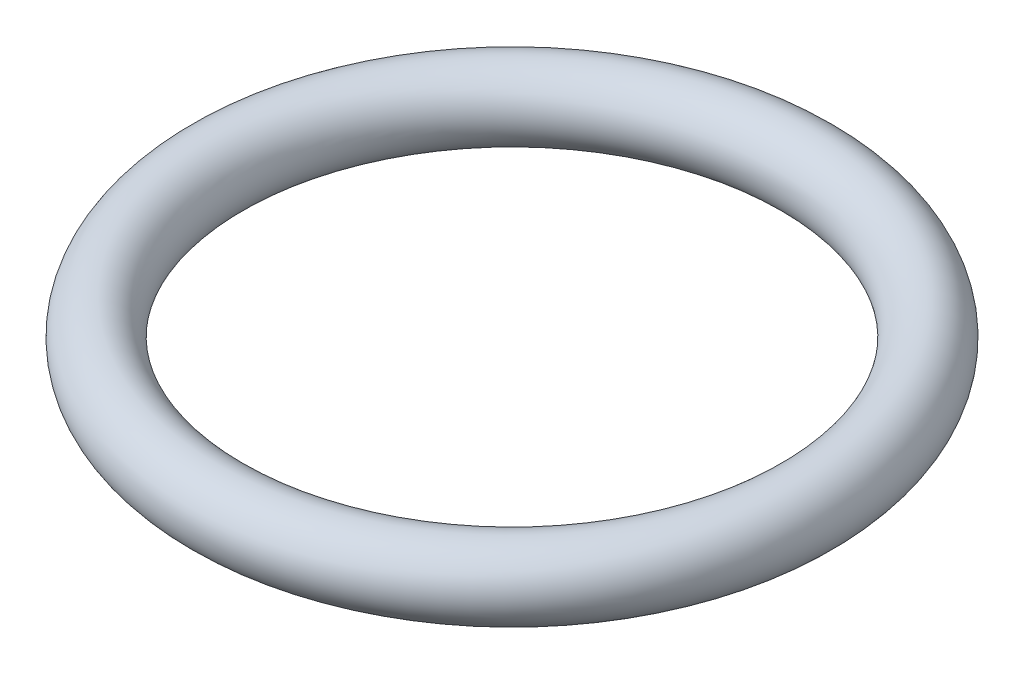
ISO-10303-21;
HEADER;
FILE_DESCRIPTION(('STEP AP214'),'2;1');
FILE_NAME('part.step','',(''),(''),'','','');
FILE_SCHEMA(('AUTOMOTIVE_DESIGN { 1 0 10303 214 1 1 1 1 }'));
ENDSEC;
DATA;
#1=APPLICATION_CONTEXT('core data for automotive mechanical design processes');
#2=APPLICATION_PROTOCOL_DEFINITION('international standard','automotive_design',2000,#1);
#3=PRODUCT_CONTEXT('',#1,'mechanical');
#4=PRODUCT('Part','Part','',(#3));
#5=PRODUCT_RELATED_PRODUCT_CATEGORY('part','',(#4));
#6=PRODUCT_DEFINITION_FORMATION('','',#4);
#7=PRODUCT_DEFINITION_CONTEXT('part definition',#1,'design');
#8=PRODUCT_DEFINITION('design','',#6,#7);
#9=PRODUCT_DEFINITION_SHAPE('','',#8);
#10=(LENGTH_UNIT() NAMED_UNIT(*) SI_UNIT(.MILLI.,.METRE.));
#11=(NAMED_UNIT(*) PLANE_ANGLE_UNIT() SI_UNIT($,.RADIAN.));
#12=(NAMED_UNIT(*) SI_UNIT($,.STERADIAN.) SOLID_ANGLE_UNIT());
#13=UNCERTAINTY_MEASURE_WITH_UNIT(LENGTH_MEASURE(1.E-05),#10,'distance_accuracy_value','');
#14=(GEOMETRIC_REPRESENTATION_CONTEXT(3) GLOBAL_UNCERTAINTY_ASSIGNED_CONTEXT((#13)) GLOBAL_UNIT_ASSIGNED_CONTEXT((#10,
#11,#12)) REPRESENTATION_CONTEXT('',''));
#15=CARTESIAN_POINT('',(0.,0.,0.));
#16=DIRECTION('',(0.,0.,1.));
#17=DIRECTION('',(1.,0.,0.));
#18=AXIS2_PLACEMENT_3D('',#15,#16,#17);
#19=CARTESIAN_POINT('',(0.,0.,0.));
#20=DIRECTION('',(0.,1.,0.));
#21=DIRECTION('',(0.,0.,1.));
#22=AXIS2_PLACEMENT_3D('',#19,#20,#21);
#23=TOROIDAL_SURFACE('',#22,11.,1.325);
#24=CARTESIAN_POINT('',(0.,0.,11.));
#25=DIRECTION('',(1.,0.,0.));
#26=DIRECTION('',(0.,0.,-1.));
#27=AXIS2_PLACEMENT_3D('',#24,#25,#26);
#28=CIRCLE('',#27,1.325);
#29=CARTESIAN_POINT('',(0.,0.,12.325));
#30=VERTEX_POINT('',#29);
#31=EDGE_CURVE('E11',#30,#30,#28,.T.);
#32=CARTESIAN_POINT('',(0.,0.,0.));
#33=DIRECTION('',(0.,1.,0.));
#34=DIRECTION('',(0.,0.,1.));
#35=AXIS2_PLACEMENT_3D('',#32,#33,#34);
#36=CIRCLE('',#35,12.325);
#37=EDGE_CURVE('',#30,#30,#36,.T.);
#38=ORIENTED_EDGE('',*,*,#31,.T.);
#39=ORIENTED_EDGE('',*,*,#31,.F.);
#40=ORIENTED_EDGE('',*,*,#37,.T.);
#41=ORIENTED_EDGE('',*,*,#37,.F.);
#42=EDGE_LOOP('',(#38,#40,#39,#41));
#43=FACE_BOUND('',#42,.T.);
#44=ADVANCED_FACE('F53',(#43),#23,.T.);
#45=CLOSED_SHELL('',(#44));
#46=MANIFOLD_SOLID_BREP('B2',#45);
#47=ADVANCED_BREP_SHAPE_REPRESENTATION('',(#18,#46),#14);
#48=SHAPE_DEFINITION_REPRESENTATION(#9,#47);
ENDSEC;
END-ISO-10303-21;
